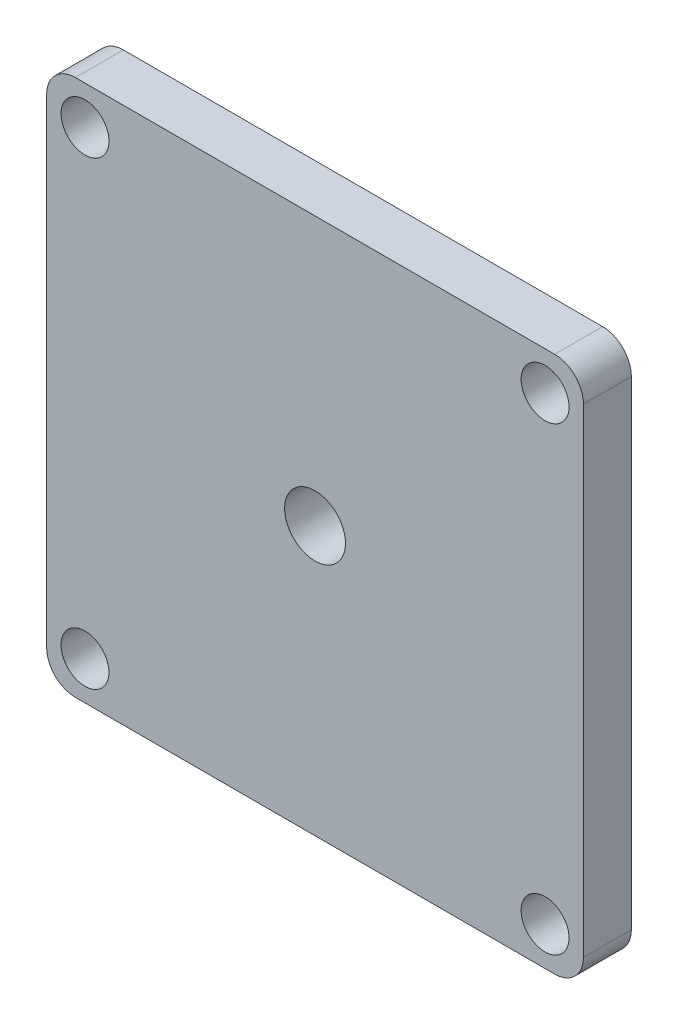
ISO-10303-21;
HEADER;
FILE_DESCRIPTION(('STEP AP214'),'2;1');
FILE_NAME('part.step','',(''),(''),'','','');
FILE_SCHEMA(('AUTOMOTIVE_DESIGN { 1 0 10303 214 1 1 1 1 }'));
ENDSEC;
DATA;
#1=APPLICATION_CONTEXT('core data for automotive mechanical design processes');
#2=APPLICATION_PROTOCOL_DEFINITION('international standard','automotive_design',2000,#1);
#3=PRODUCT_CONTEXT('',#1,'mechanical');
#4=PRODUCT('Part','Part','',(#3));
#5=PRODUCT_RELATED_PRODUCT_CATEGORY('part','',(#4));
#6=PRODUCT_DEFINITION_FORMATION('','',#4);
#7=PRODUCT_DEFINITION_CONTEXT('part definition',#1,'design');
#8=PRODUCT_DEFINITION('design','',#6,#7);
#9=PRODUCT_DEFINITION_SHAPE('','',#8);
#10=(LENGTH_UNIT() NAMED_UNIT(*) SI_UNIT(.MILLI.,.METRE.));
#11=(NAMED_UNIT(*) PLANE_ANGLE_UNIT() SI_UNIT($,.RADIAN.));
#12=(NAMED_UNIT(*) SI_UNIT($,.STERADIAN.) SOLID_ANGLE_UNIT());
#13=UNCERTAINTY_MEASURE_WITH_UNIT(LENGTH_MEASURE(1.E-05),#10,'distance_accuracy_value','');
#14=(GEOMETRIC_REPRESENTATION_CONTEXT(3) GLOBAL_UNCERTAINTY_ASSIGNED_CONTEXT((#13)) GLOBAL_UNIT_ASSIGNED_CONTEXT((#10,
#11,#12)) REPRESENTATION_CONTEXT('',''));
#15=CARTESIAN_POINT('',(0.,0.,0.));
#16=DIRECTION('',(0.,0.,1.));
#17=DIRECTION('',(1.,0.,0.));
#18=AXIS2_PLACEMENT_3D('',#15,#16,#17);
#19=CARTESIAN_POINT('',(-25.,25.,5.));
#20=DIRECTION('',(0.,0.,1.));
#21=DIRECTION('',(1.,0.,0.));
#22=AXIS2_PLACEMENT_3D('',#19,#20,#21);
#23=PLANE('',#22);
#24=CARTESIAN_POINT('',(0.,0.,5.));
#25=DIRECTION('',(0.,0.,1.));
#26=DIRECTION('',(1.,0.,0.));
#27=AXIS2_PLACEMENT_3D('',#24,#25,#26);
#28=CIRCLE('',#27,3.17500000000004);
#29=CARTESIAN_POINT('',(3.17500000000004,0.,5.));
#30=VERTEX_POINT('',#29);
#31=EDGE_CURVE('E194',#30,#30,#28,.T.);
#32=ORIENTED_EDGE('',*,*,#31,.F.);
#33=EDGE_LOOP('',(#32));
#34=FACE_BOUND('',#33,.T.);
#35=CARTESIAN_POINT('',(24.,-24.0000000000014,5.));
#36=DIRECTION('',(0.,0.,1.));
#37=DIRECTION('',(1.,0.,0.));
#38=AXIS2_PLACEMENT_3D('',#35,#36,#37);
#39=CIRCLE('',#38,2.5000000000014);
#40=CARTESIAN_POINT('',(26.5000000000014,-24.0000000000014,5.));
#41=VERTEX_POINT('',#40);
#42=EDGE_CURVE('E182',#41,#41,#39,.T.);
#43=ORIENTED_EDGE('',*,*,#42,.F.);
#44=EDGE_LOOP('',(#43));
#45=FACE_BOUND('',#44,.T.);
#46=CARTESIAN_POINT('',(-25.,25.,5.));
#47=DIRECTION('',(0.,0.,1.));
#48=DIRECTION('',(1.,0.,0.));
#49=AXIS2_PLACEMENT_3D('',#46,#47,#48);
#50=CIRCLE('',#49,3.);
#51=CARTESIAN_POINT('',(-25.,28.,5.));
#52=VERTEX_POINT('',#51);
#53=CARTESIAN_POINT('',(-28.,25.,5.));
#54=VERTEX_POINT('',#53);
#55=EDGE_CURVE('E145',#52,#54,#50,.T.);
#56=ORIENTED_EDGE('',*,*,#55,.T.);
#57=DIRECTION('',(0.,-1.,0.));
#58=VECTOR('',#57,1.);
#59=CARTESIAN_POINT('',(-28.,25.,5.));
#60=LINE('',#59,#58);
#61=CARTESIAN_POINT('',(-28.,-25.,5.));
#62=VERTEX_POINT('',#61);
#63=EDGE_CURVE('E93',#54,#62,#60,.T.);
#64=ORIENTED_EDGE('',*,*,#63,.T.);
#65=CARTESIAN_POINT('',(-25.,-25.,5.));
#66=DIRECTION('',(0.,0.,1.));
#67=DIRECTION('',(1.,0.,0.));
#68=AXIS2_PLACEMENT_3D('',#65,#66,#67);
#69=CIRCLE('',#68,3.);
#70=CARTESIAN_POINT('',(-25.,-28.,5.));
#71=VERTEX_POINT('',#70);
#72=EDGE_CURVE('E160',#62,#71,#69,.T.);
#73=ORIENTED_EDGE('',*,*,#72,.T.);
#74=DIRECTION('',(1.,0.,0.));
#75=VECTOR('',#74,1.);
#76=CARTESIAN_POINT('',(-25.,-28.,5.));
#77=LINE('',#76,#75);
#78=CARTESIAN_POINT('',(25.,-28.,5.));
#79=VERTEX_POINT('',#78);
#80=EDGE_CURVE('E173',#71,#79,#77,.T.);
#81=ORIENTED_EDGE('',*,*,#80,.T.);
#82=CARTESIAN_POINT('',(25.,-25.,5.));
#83=DIRECTION('',(0.,0.,1.));
#84=DIRECTION('',(1.,0.,0.));
#85=AXIS2_PLACEMENT_3D('',#82,#83,#84);
#86=CIRCLE('',#85,3.);
#87=CARTESIAN_POINT('',(28.,-25.,5.));
#88=VERTEX_POINT('',#87);
#89=EDGE_CURVE('E112',#79,#88,#86,.T.);
#90=ORIENTED_EDGE('',*,*,#89,.T.);
#91=DIRECTION('',(0.,1.,0.));
#92=VECTOR('',#91,1.);
#93=CARTESIAN_POINT('',(28.,-25.,5.));
#94=LINE('',#93,#92);
#95=CARTESIAN_POINT('',(28.,25.,5.));
#96=VERTEX_POINT('',#95);
#97=EDGE_CURVE('E106',#88,#96,#94,.T.);
#98=ORIENTED_EDGE('',*,*,#97,.T.);
#99=CARTESIAN_POINT('',(25.,25.,5.));
#100=DIRECTION('',(0.,0.,1.));
#101=DIRECTION('',(1.,0.,0.));
#102=AXIS2_PLACEMENT_3D('',#99,#100,#101);
#103=CIRCLE('',#102,3.);
#104=CARTESIAN_POINT('',(25.,28.,5.));
#105=VERTEX_POINT('',#104);
#106=EDGE_CURVE('E110',#96,#105,#103,.T.);
#107=ORIENTED_EDGE('',*,*,#106,.T.);
#108=DIRECTION('',(-1.,0.,0.));
#109=VECTOR('',#108,1.);
#110=CARTESIAN_POINT('',(25.,28.,5.));
#111=LINE('',#110,#109);
#112=EDGE_CURVE('E50',#105,#52,#111,.T.);
#113=ORIENTED_EDGE('',*,*,#112,.T.);
#114=EDGE_LOOP('',(#56,#64,#73,#81,#90,#98,#107,#113));
#115=FACE_BOUND('',#114,.T.);
#116=CARTESIAN_POINT('',(-24.,-24.,5.));
#117=DIRECTION('',(0.,0.,1.));
#118=DIRECTION('',(1.,0.,0.));
#119=AXIS2_PLACEMENT_3D('',#116,#117,#118);
#120=CIRCLE('',#119,2.49999999999995);
#121=CARTESIAN_POINT('',(-21.5,-24.,5.));
#122=VERTEX_POINT('',#121);
#123=EDGE_CURVE('E134',#122,#122,#120,.T.);
#124=ORIENTED_EDGE('',*,*,#123,.F.);
#125=EDGE_LOOP('',(#124));
#126=FACE_BOUND('',#125,.T.);
#127=CARTESIAN_POINT('',(-23.9999999999986,24.,5.));
#128=DIRECTION('',(0.,0.,1.));
#129=DIRECTION('',(1.,0.,0.));
#130=AXIS2_PLACEMENT_3D('',#127,#128,#129);
#131=CIRCLE('',#130,2.50000000000073);
#132=CARTESIAN_POINT('',(-21.4999999999979,24.,5.));
#133=VERTEX_POINT('',#132);
#134=EDGE_CURVE('E188',#133,#133,#131,.T.);
#135=ORIENTED_EDGE('',*,*,#134,.F.);
#136=EDGE_LOOP('',(#135));
#137=FACE_BOUND('',#136,.T.);
#138=CARTESIAN_POINT('',(24.0000000000013,23.9999999999987,5.));
#139=DIRECTION('',(0.,0.,1.));
#140=DIRECTION('',(1.,0.,0.));
#141=AXIS2_PLACEMENT_3D('',#138,#139,#140);
#142=CIRCLE('',#141,2.50000000000194);
#143=CARTESIAN_POINT('',(26.5000000000033,23.9999999999987,5.));
#144=VERTEX_POINT('',#143);
#145=EDGE_CURVE('E200',#144,#144,#142,.T.);
#146=ORIENTED_EDGE('',*,*,#145,.F.);
#147=EDGE_LOOP('',(#146));
#148=FACE_BOUND('',#147,.T.);
#149=ADVANCED_FACE('F33',(#34,#45,#115,#126,#137,#148),#23,.T.);
#150=CARTESIAN_POINT('',(-25.,25.,0.));
#151=DIRECTION('',(0.,0.,1.));
#152=DIRECTION('',(1.,0.,0.));
#153=AXIS2_PLACEMENT_3D('',#150,#151,#152);
#154=PLANE('',#153);
#155=CARTESIAN_POINT('',(-25.,25.,0.));
#156=DIRECTION('',(0.,0.,1.));
#157=DIRECTION('',(1.,0.,0.));
#158=AXIS2_PLACEMENT_3D('',#155,#156,#157);
#159=CIRCLE('',#158,3.);
#160=CARTESIAN_POINT('',(-25.,28.,0.));
#161=VERTEX_POINT('',#160);
#162=CARTESIAN_POINT('',(-28.,25.,0.));
#163=VERTEX_POINT('',#162);
#164=EDGE_CURVE('E130',#161,#163,#159,.T.);
#165=ORIENTED_EDGE('',*,*,#164,.F.);
#166=DIRECTION('',(-1.,0.,0.));
#167=VECTOR('',#166,1.);
#168=CARTESIAN_POINT('',(25.,28.,0.));
#169=LINE('',#168,#167);
#170=CARTESIAN_POINT('',(25.,28.,0.));
#171=VERTEX_POINT('',#170);
#172=EDGE_CURVE('E85',#171,#161,#169,.T.);
#173=ORIENTED_EDGE('',*,*,#172,.F.);
#174=CARTESIAN_POINT('',(25.,25.,0.));
#175=DIRECTION('',(0.,0.,1.));
#176=DIRECTION('',(1.,0.,0.));
#177=AXIS2_PLACEMENT_3D('',#174,#175,#176);
#178=CIRCLE('',#177,3.);
#179=CARTESIAN_POINT('',(28.,25.,0.));
#180=VERTEX_POINT('',#179);
#181=EDGE_CURVE('E79',#180,#171,#178,.T.);
#182=ORIENTED_EDGE('',*,*,#181,.F.);
#183=DIRECTION('',(0.,1.,0.));
#184=VECTOR('',#183,1.);
#185=CARTESIAN_POINT('',(28.,-25.,0.));
#186=LINE('',#185,#184);
#187=CARTESIAN_POINT('',(28.,-25.,0.));
#188=VERTEX_POINT('',#187);
#189=EDGE_CURVE('E120',#188,#180,#186,.T.);
#190=ORIENTED_EDGE('',*,*,#189,.F.);
#191=CARTESIAN_POINT('',(25.,-25.,0.));
#192=DIRECTION('',(0.,0.,1.));
#193=DIRECTION('',(1.,0.,0.));
#194=AXIS2_PLACEMENT_3D('',#191,#192,#193);
#195=CIRCLE('',#194,3.);
#196=CARTESIAN_POINT('',(25.,-28.,0.));
#197=VERTEX_POINT('',#196);
#198=EDGE_CURVE('E140',#197,#188,#195,.T.);
#199=ORIENTED_EDGE('',*,*,#198,.F.);
#200=DIRECTION('',(1.,0.,0.));
#201=VECTOR('',#200,1.);
#202=CARTESIAN_POINT('',(-25.,-28.,0.));
#203=LINE('',#202,#201);
#204=CARTESIAN_POINT('',(-25.,-28.,0.));
#205=VERTEX_POINT('',#204);
#206=EDGE_CURVE('E138',#205,#197,#203,.T.);
#207=ORIENTED_EDGE('',*,*,#206,.F.);
#208=CARTESIAN_POINT('',(-25.,-25.,0.));
#209=DIRECTION('',(0.,0.,1.));
#210=DIRECTION('',(1.,0.,0.));
#211=AXIS2_PLACEMENT_3D('',#208,#209,#210);
#212=CIRCLE('',#211,3.);
#213=CARTESIAN_POINT('',(-28.,-25.,0.));
#214=VERTEX_POINT('',#213);
#215=EDGE_CURVE('E136',#214,#205,#212,.T.);
#216=ORIENTED_EDGE('',*,*,#215,.F.);
#217=DIRECTION('',(0.,-1.,0.));
#218=VECTOR('',#217,1.);
#219=CARTESIAN_POINT('',(-28.,25.,0.));
#220=LINE('',#219,#218);
#221=EDGE_CURVE('E133',#163,#214,#220,.T.);
#222=ORIENTED_EDGE('',*,*,#221,.F.);
#223=EDGE_LOOP('',(#165,#173,#182,#190,#199,#207,#216,#222));
#224=FACE_BOUND('',#223,.T.);
#225=CARTESIAN_POINT('',(-24.,-24.,0.));
#226=DIRECTION('',(0.,0.,1.));
#227=DIRECTION('',(1.,0.,0.));
#228=AXIS2_PLACEMENT_3D('',#225,#226,#227);
#229=CIRCLE('',#228,2.49999999999995);
#230=CARTESIAN_POINT('',(-21.5,-24.,0.));
#231=VERTEX_POINT('',#230);
#232=EDGE_CURVE('E179',#231,#231,#229,.T.);
#233=ORIENTED_EDGE('',*,*,#232,.T.);
#234=EDGE_LOOP('',(#233));
#235=FACE_BOUND('',#234,.T.);
#236=CARTESIAN_POINT('',(24.,-24.0000000000014,0.));
#237=DIRECTION('',(0.,0.,1.));
#238=DIRECTION('',(1.,0.,0.));
#239=AXIS2_PLACEMENT_3D('',#236,#237,#238);
#240=CIRCLE('',#239,2.5000000000014);
#241=CARTESIAN_POINT('',(26.5000000000014,-24.0000000000014,0.));
#242=VERTEX_POINT('',#241);
#243=EDGE_CURVE('E185',#242,#242,#240,.T.);
#244=ORIENTED_EDGE('',*,*,#243,.T.);
#245=EDGE_LOOP('',(#244));
#246=FACE_BOUND('',#245,.T.);
#247=CARTESIAN_POINT('',(-23.9999999999986,24.,0.));
#248=DIRECTION('',(0.,0.,1.));
#249=DIRECTION('',(1.,0.,0.));
#250=AXIS2_PLACEMENT_3D('',#247,#248,#249);
#251=CIRCLE('',#250,2.50000000000073);
#252=CARTESIAN_POINT('',(-21.4999999999979,24.,0.));
#253=VERTEX_POINT('',#252);
#254=EDGE_CURVE('E191',#253,#253,#251,.T.);
#255=ORIENTED_EDGE('',*,*,#254,.T.);
#256=EDGE_LOOP('',(#255));
#257=FACE_BOUND('',#256,.T.);
#258=CARTESIAN_POINT('',(0.,0.,0.));
#259=DIRECTION('',(0.,0.,1.));
#260=DIRECTION('',(1.,0.,0.));
#261=AXIS2_PLACEMENT_3D('',#258,#259,#260);
#262=CIRCLE('',#261,3.17500000000004);
#263=CARTESIAN_POINT('',(3.17500000000004,0.,0.));
#264=VERTEX_POINT('',#263);
#265=EDGE_CURVE('E197',#264,#264,#262,.T.);
#266=ORIENTED_EDGE('',*,*,#265,.T.);
#267=EDGE_LOOP('',(#266));
#268=FACE_BOUND('',#267,.T.);
#269=CARTESIAN_POINT('',(24.0000000000013,23.9999999999987,0.));
#270=DIRECTION('',(0.,0.,1.));
#271=DIRECTION('',(1.,0.,0.));
#272=AXIS2_PLACEMENT_3D('',#269,#270,#271);
#273=CIRCLE('',#272,2.50000000000194);
#274=CARTESIAN_POINT('',(26.5000000000033,23.9999999999987,0.));
#275=VERTEX_POINT('',#274);
#276=EDGE_CURVE('E203',#275,#275,#273,.T.);
#277=ORIENTED_EDGE('',*,*,#276,.T.);
#278=EDGE_LOOP('',(#277));
#279=FACE_BOUND('',#278,.T.);
#280=ADVANCED_FACE('F164',(#224,#235,#246,#257,#268,#279),#154,.F.);
#281=CARTESIAN_POINT('',(-25.,25.,5.));
#282=DIRECTION('',(0.,0.,-1.));
#283=DIRECTION('',(-1.,0.,0.));
#284=AXIS2_PLACEMENT_3D('',#281,#282,#283);
#285=CYLINDRICAL_SURFACE('',#284,3.);
#286=ORIENTED_EDGE('',*,*,#164,.T.);
#287=DIRECTION('',(0.,0.,-1.));
#288=VECTOR('',#287,1.);
#289=CARTESIAN_POINT('',(-28.,25.,5.));
#290=LINE('',#289,#288);
#291=EDGE_CURVE('E11',#54,#163,#290,.T.);
#292=ORIENTED_EDGE('',*,*,#291,.F.);
#293=ORIENTED_EDGE('',*,*,#55,.F.);
#294=DIRECTION('',(0.,0.,-1.));
#295=VECTOR('',#294,1.);
#296=CARTESIAN_POINT('',(-25.,28.,5.));
#297=LINE('',#296,#295);
#298=EDGE_CURVE('E126',#52,#161,#297,.T.);
#299=ORIENTED_EDGE('',*,*,#298,.T.);
#300=EDGE_LOOP('',(#286,#292,#293,#299));
#301=FACE_BOUND('',#300,.T.);
#302=ADVANCED_FACE('F35',(#301),#285,.T.);
#303=CARTESIAN_POINT('',(-28.,25.,5.));
#304=DIRECTION('',(1.,0.,0.));
#305=DIRECTION('',(0.,1.,0.));
#306=AXIS2_PLACEMENT_3D('',#303,#304,#305);
#307=PLANE('',#306);
#308=ORIENTED_EDGE('',*,*,#221,.T.);
#309=DIRECTION('',(0.,0.,-1.));
#310=VECTOR('',#309,1.);
#311=CARTESIAN_POINT('',(-28.,-25.,5.));
#312=LINE('',#311,#310);
#313=EDGE_CURVE('E42',#62,#214,#312,.T.);
#314=ORIENTED_EDGE('',*,*,#313,.F.);
#315=ORIENTED_EDGE('',*,*,#63,.F.);
#316=ORIENTED_EDGE('',*,*,#291,.T.);
#317=EDGE_LOOP('',(#308,#314,#315,#316));
#318=FACE_BOUND('',#317,.T.);
#319=ADVANCED_FACE('F237',(#318),#307,.F.);
#320=CARTESIAN_POINT('',(-25.,-25.,5.));
#321=DIRECTION('',(0.,0.,-1.));
#322=DIRECTION('',(-1.,0.,0.));
#323=AXIS2_PLACEMENT_3D('',#320,#321,#322);
#324=CYLINDRICAL_SURFACE('',#323,3.);
#325=ORIENTED_EDGE('',*,*,#215,.T.);
#326=DIRECTION('',(0.,0.,-1.));
#327=VECTOR('',#326,1.);
#328=CARTESIAN_POINT('',(-25.,-28.,5.));
#329=LINE('',#328,#327);
#330=EDGE_CURVE('E152',#71,#205,#329,.T.);
#331=ORIENTED_EDGE('',*,*,#330,.F.);
#332=ORIENTED_EDGE('',*,*,#72,.F.);
#333=ORIENTED_EDGE('',*,*,#313,.T.);
#334=EDGE_LOOP('',(#325,#331,#332,#333));
#335=FACE_BOUND('',#334,.T.);
#336=ADVANCED_FACE('F158',(#335),#324,.T.);
#337=CARTESIAN_POINT('',(-25.,-28.,5.));
#338=DIRECTION('',(0.,1.,0.));
#339=DIRECTION('',(0.,0.,1.));
#340=AXIS2_PLACEMENT_3D('',#337,#338,#339);
#341=PLANE('',#340);
#342=ORIENTED_EDGE('',*,*,#206,.T.);
#343=DIRECTION('',(0.,0.,-1.));
#344=VECTOR('',#343,1.);
#345=CARTESIAN_POINT('',(25.,-28.,5.));
#346=LINE('',#345,#344);
#347=EDGE_CURVE('E149',#79,#197,#346,.T.);
#348=ORIENTED_EDGE('',*,*,#347,.F.);
#349=ORIENTED_EDGE('',*,*,#80,.F.);
#350=ORIENTED_EDGE('',*,*,#330,.T.);
#351=EDGE_LOOP('',(#342,#348,#349,#350));
#352=FACE_BOUND('',#351,.T.);
#353=ADVANCED_FACE('F169',(#352),#341,.F.);
#354=CARTESIAN_POINT('',(25.,-25.,5.));
#355=DIRECTION('',(0.,0.,-1.));
#356=DIRECTION('',(-1.,0.,0.));
#357=AXIS2_PLACEMENT_3D('',#354,#355,#356);
#358=CYLINDRICAL_SURFACE('',#357,3.);
#359=ORIENTED_EDGE('',*,*,#198,.T.);
#360=DIRECTION('',(0.,0.,-1.));
#361=VECTOR('',#360,1.);
#362=CARTESIAN_POINT('',(28.,-25.,5.));
#363=LINE('',#362,#361);
#364=EDGE_CURVE('E121',#88,#188,#363,.T.);
#365=ORIENTED_EDGE('',*,*,#364,.F.);
#366=ORIENTED_EDGE('',*,*,#89,.F.);
#367=ORIENTED_EDGE('',*,*,#347,.T.);
#368=EDGE_LOOP('',(#359,#365,#366,#367));
#369=FACE_BOUND('',#368,.T.);
#370=ADVANCED_FACE('F172',(#369),#358,.T.);
#371=CARTESIAN_POINT('',(28.,-25.,5.));
#372=DIRECTION('',(-1.,0.,0.));
#373=DIRECTION('',(0.,0.,1.));
#374=AXIS2_PLACEMENT_3D('',#371,#372,#373);
#375=PLANE('',#374);
#376=ORIENTED_EDGE('',*,*,#189,.T.);
#377=DIRECTION('',(0.,0.,-1.));
#378=VECTOR('',#377,1.);
#379=CARTESIAN_POINT('',(28.,25.,5.));
#380=LINE('',#379,#378);
#381=EDGE_CURVE('E117',#96,#180,#380,.T.);
#382=ORIENTED_EDGE('',*,*,#381,.F.);
#383=ORIENTED_EDGE('',*,*,#97,.F.);
#384=ORIENTED_EDGE('',*,*,#364,.T.);
#385=EDGE_LOOP('',(#376,#382,#383,#384));
#386=FACE_BOUND('',#385,.T.);
#387=ADVANCED_FACE('F118',(#386),#375,.F.);
#388=CARTESIAN_POINT('',(25.,25.,5.));
#389=DIRECTION('',(0.,0.,-1.));
#390=DIRECTION('',(-1.,0.,0.));
#391=AXIS2_PLACEMENT_3D('',#388,#389,#390);
#392=CYLINDRICAL_SURFACE('',#391,3.);
#393=ORIENTED_EDGE('',*,*,#181,.T.);
#394=DIRECTION('',(0.,0.,-1.));
#395=VECTOR('',#394,1.);
#396=CARTESIAN_POINT('',(25.,28.,5.));
#397=LINE('',#396,#395);
#398=EDGE_CURVE('E122',#105,#171,#397,.T.);
#399=ORIENTED_EDGE('',*,*,#398,.F.);
#400=ORIENTED_EDGE('',*,*,#106,.F.);
#401=ORIENTED_EDGE('',*,*,#381,.T.);
#402=EDGE_LOOP('',(#393,#399,#400,#401));
#403=FACE_BOUND('',#402,.T.);
#404=ADVANCED_FACE('F124',(#403),#392,.T.);
#405=CARTESIAN_POINT('',(25.,28.,5.));
#406=DIRECTION('',(0.,-1.,0.));
#407=DIRECTION('',(0.,0.,-1.));
#408=AXIS2_PLACEMENT_3D('',#405,#406,#407);
#409=PLANE('',#408);
#410=ORIENTED_EDGE('',*,*,#172,.T.);
#411=ORIENTED_EDGE('',*,*,#298,.F.);
#412=ORIENTED_EDGE('',*,*,#112,.F.);
#413=ORIENTED_EDGE('',*,*,#398,.T.);
#414=EDGE_LOOP('',(#410,#411,#412,#413));
#415=FACE_BOUND('',#414,.T.);
#416=ADVANCED_FACE('F225',(#415),#409,.F.);
#417=CARTESIAN_POINT('',(-24.,-24.,5.));
#418=DIRECTION('',(0.,0.,-1.));
#419=DIRECTION('',(-1.,0.,0.));
#420=AXIS2_PLACEMENT_3D('',#417,#418,#419);
#421=CYLINDRICAL_SURFACE('',#420,2.49999999999995);
#422=ORIENTED_EDGE('',*,*,#123,.T.);
#423=EDGE_LOOP('',(#422));
#424=FACE_BOUND('',#423,.T.);
#425=ORIENTED_EDGE('',*,*,#232,.F.);
#426=EDGE_LOOP('',(#425));
#427=FACE_BOUND('',#426,.T.);
#428=ADVANCED_FACE('F222',(#424,#427),#421,.F.);
#429=CARTESIAN_POINT('',(24.,-24.0000000000014,5.));
#430=DIRECTION('',(0.,0.,-1.));
#431=DIRECTION('',(-1.,0.,0.));
#432=AXIS2_PLACEMENT_3D('',#429,#430,#431);
#433=CYLINDRICAL_SURFACE('',#432,2.5000000000014);
#434=ORIENTED_EDGE('',*,*,#42,.T.);
#435=EDGE_LOOP('',(#434));
#436=FACE_BOUND('',#435,.T.);
#437=ORIENTED_EDGE('',*,*,#243,.F.);
#438=EDGE_LOOP('',(#437));
#439=FACE_BOUND('',#438,.T.);
#440=ADVANCED_FACE('F301',(#436,#439),#433,.F.);
#441=CARTESIAN_POINT('',(-23.9999999999986,24.,5.));
#442=DIRECTION('',(0.,0.,-1.));
#443=DIRECTION('',(-1.,0.,0.));
#444=AXIS2_PLACEMENT_3D('',#441,#442,#443);
#445=CYLINDRICAL_SURFACE('',#444,2.50000000000073);
#446=ORIENTED_EDGE('',*,*,#134,.T.);
#447=EDGE_LOOP('',(#446));
#448=FACE_BOUND('',#447,.T.);
#449=ORIENTED_EDGE('',*,*,#254,.F.);
#450=EDGE_LOOP('',(#449));
#451=FACE_BOUND('',#450,.T.);
#452=ADVANCED_FACE('F309',(#448,#451),#445,.F.);
#453=CARTESIAN_POINT('',(0.,0.,5.));
#454=DIRECTION('',(0.,0.,-1.));
#455=DIRECTION('',(-1.,0.,0.));
#456=AXIS2_PLACEMENT_3D('',#453,#454,#455);
#457=CYLINDRICAL_SURFACE('',#456,3.17500000000004);
#458=ORIENTED_EDGE('',*,*,#31,.T.);
#459=EDGE_LOOP('',(#458));
#460=FACE_BOUND('',#459,.T.);
#461=ORIENTED_EDGE('',*,*,#265,.F.);
#462=EDGE_LOOP('',(#461));
#463=FACE_BOUND('',#462,.T.);
#464=ADVANCED_FACE('F317',(#460,#463),#457,.F.);
#465=CARTESIAN_POINT('',(24.0000000000013,23.9999999999987,5.));
#466=DIRECTION('',(0.,0.,-1.));
#467=DIRECTION('',(-1.,0.,0.));
#468=AXIS2_PLACEMENT_3D('',#465,#466,#467);
#469=CYLINDRICAL_SURFACE('',#468,2.50000000000194);
#470=ORIENTED_EDGE('',*,*,#145,.T.);
#471=EDGE_LOOP('',(#470));
#472=FACE_BOUND('',#471,.T.);
#473=ORIENTED_EDGE('',*,*,#276,.F.);
#474=EDGE_LOOP('',(#473));
#475=FACE_BOUND('',#474,.T.);
#476=ADVANCED_FACE('F209',(#472,#475),#469,.F.);
#477=CLOSED_SHELL('',(#149,#280,#302,#319,#336,#353,#370,#387,#404,#416,#428,#440,#452,#464,#476));
#478=MANIFOLD_SOLID_BREP('B2',#477);
#479=ADVANCED_BREP_SHAPE_REPRESENTATION('',(#18,#478),#14);
#480=SHAPE_DEFINITION_REPRESENTATION(#9,#479);
ENDSEC;
END-ISO-10303-21;
